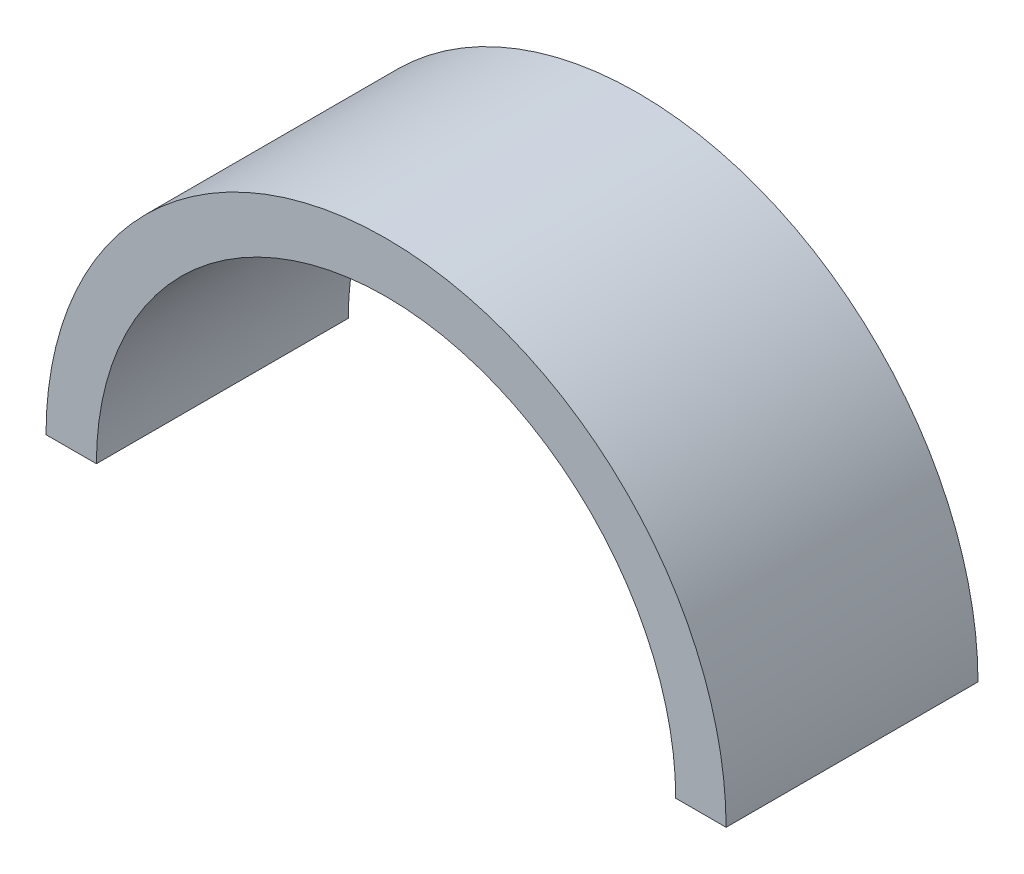
ISO-10303-21;
HEADER;
FILE_DESCRIPTION(('STEP AP214'),'2;1');
FILE_NAME('part.step','',(''),(''),'','','');
FILE_SCHEMA(('AUTOMOTIVE_DESIGN { 1 0 10303 214 1 1 1 1 }'));
ENDSEC;
DATA;
#1=APPLICATION_CONTEXT('core data for automotive mechanical design processes');
#2=APPLICATION_PROTOCOL_DEFINITION('international standard','automotive_design',2000,#1);
#3=PRODUCT_CONTEXT('',#1,'mechanical');
#4=PRODUCT('Part','Part','',(#3));
#5=PRODUCT_RELATED_PRODUCT_CATEGORY('part','',(#4));
#6=PRODUCT_DEFINITION_FORMATION('','',#4);
#7=PRODUCT_DEFINITION_CONTEXT('part definition',#1,'design');
#8=PRODUCT_DEFINITION('design','',#6,#7);
#9=PRODUCT_DEFINITION_SHAPE('','',#8);
#10=(LENGTH_UNIT() NAMED_UNIT(*) SI_UNIT(.MILLI.,.METRE.));
#11=(NAMED_UNIT(*) PLANE_ANGLE_UNIT() SI_UNIT($,.RADIAN.));
#12=(NAMED_UNIT(*) SI_UNIT($,.STERADIAN.) SOLID_ANGLE_UNIT());
#13=UNCERTAINTY_MEASURE_WITH_UNIT(LENGTH_MEASURE(1.E-05),#10,'distance_accuracy_value','');
#14=(GEOMETRIC_REPRESENTATION_CONTEXT(3) GLOBAL_UNCERTAINTY_ASSIGNED_CONTEXT((#13)) GLOBAL_UNIT_ASSIGNED_CONTEXT((#10,
#11,#12)) REPRESENTATION_CONTEXT('',''));
#15=CARTESIAN_POINT('',(0.,0.,0.));
#16=DIRECTION('',(0.,0.,1.));
#17=DIRECTION('',(1.,0.,0.));
#18=AXIS2_PLACEMENT_3D('',#15,#16,#17);
#19=CARTESIAN_POINT('',(27.,27.,20.));
#20=DIRECTION('',(0.,0.,-1.));
#21=DIRECTION('',(-1.,0.,0.));
#22=AXIS2_PLACEMENT_3D('',#19,#20,#21);
#23=CYLINDRICAL_SURFACE('',#22,27.);
#24=CARTESIAN_POINT('',(27.,27.,0.));
#25=DIRECTION('',(0.,0.,1.));
#26=DIRECTION('',(-1.,0.,0.));
#27=AXIS2_PLACEMENT_3D('',#24,#25,#26);
#28=CIRCLE('',#27,27.);
#29=CARTESIAN_POINT('',(54.,27.,0.));
#30=VERTEX_POINT('',#29);
#31=CARTESIAN_POINT('',(0.,27.,0.));
#32=VERTEX_POINT('',#31);
#33=EDGE_CURVE('E108',#30,#32,#28,.T.);
#34=ORIENTED_EDGE('',*,*,#33,.T.);
#35=DIRECTION('',(0.,0.,-1.));
#36=VECTOR('',#35,1.);
#37=CARTESIAN_POINT('',(0.,27.,20.));
#38=LINE('',#37,#36);
#39=CARTESIAN_POINT('',(0.,27.,20.));
#40=VERTEX_POINT('',#39);
#41=EDGE_CURVE('E11',#40,#32,#38,.T.);
#42=ORIENTED_EDGE('',*,*,#41,.F.);
#43=CARTESIAN_POINT('',(27.,27.,20.));
#44=DIRECTION('',(0.,0.,1.));
#45=DIRECTION('',(-1.,0.,0.));
#46=AXIS2_PLACEMENT_3D('',#43,#44,#45);
#47=CIRCLE('',#46,27.);
#48=CARTESIAN_POINT('',(54.,27.,20.));
#49=VERTEX_POINT('',#48);
#50=EDGE_CURVE('E92',#49,#40,#47,.T.);
#51=ORIENTED_EDGE('',*,*,#50,.F.);
#52=DIRECTION('',(0.,0.,-1.));
#53=VECTOR('',#52,1.);
#54=CARTESIAN_POINT('',(54.,27.,20.));
#55=LINE('',#54,#53);
#56=EDGE_CURVE('E105',#49,#30,#55,.T.);
#57=ORIENTED_EDGE('',*,*,#56,.T.);
#58=EDGE_LOOP('',(#34,#42,#51,#57));
#59=FACE_BOUND('',#58,.T.);
#60=ADVANCED_FACE('F43',(#59),#23,.T.);
#61=CARTESIAN_POINT('',(4.,27.,20.));
#62=DIRECTION('',(0.,1.,0.));
#63=DIRECTION('',(0.,0.,1.));
#64=AXIS2_PLACEMENT_3D('',#61,#62,#63);
#65=PLANE('',#64);
#66=DIRECTION('',(1.,0.,0.));
#67=VECTOR('',#66,1.);
#68=CARTESIAN_POINT('',(4.,27.,0.));
#69=LINE('',#68,#67);
#70=CARTESIAN_POINT('',(4.,27.,0.));
#71=VERTEX_POINT('',#70);
#72=EDGE_CURVE('E97',#32,#71,#69,.T.);
#73=ORIENTED_EDGE('',*,*,#72,.T.);
#74=DIRECTION('',(0.,0.,-1.));
#75=VECTOR('',#74,1.);
#76=CARTESIAN_POINT('',(4.,27.,20.));
#77=LINE('',#76,#75);
#78=CARTESIAN_POINT('',(4.,27.,20.));
#79=VERTEX_POINT('',#78);
#80=EDGE_CURVE('E51',#79,#71,#77,.T.);
#81=ORIENTED_EDGE('',*,*,#80,.F.);
#82=DIRECTION('',(1.,0.,0.));
#83=VECTOR('',#82,1.);
#84=CARTESIAN_POINT('',(4.,27.,20.));
#85=LINE('',#84,#83);
#86=EDGE_CURVE('E87',#40,#79,#85,.T.);
#87=ORIENTED_EDGE('',*,*,#86,.F.);
#88=ORIENTED_EDGE('',*,*,#41,.T.);
#89=EDGE_LOOP('',(#73,#81,#87,#88));
#90=FACE_BOUND('',#89,.T.);
#91=ADVANCED_FACE('F100',(#90),#65,.F.);
#92=CARTESIAN_POINT('',(27.,27.,20.));
#93=DIRECTION('',(0.,0.,-1.));
#94=DIRECTION('',(-1.,0.,0.));
#95=AXIS2_PLACEMENT_3D('',#92,#93,#94);
#96=CYLINDRICAL_SURFACE('',#95,23.);
#97=CARTESIAN_POINT('',(27.,27.,0.));
#98=DIRECTION('',(0.,0.,-1.));
#99=DIRECTION('',(1.,0.,0.));
#100=AXIS2_PLACEMENT_3D('',#97,#98,#99);
#101=CIRCLE('',#100,23.);
#102=CARTESIAN_POINT('',(50.,27.,0.));
#103=VERTEX_POINT('',#102);
#104=EDGE_CURVE('E78',#71,#103,#101,.T.);
#105=ORIENTED_EDGE('',*,*,#104,.T.);
#106=DIRECTION('',(0.,0.,-1.));
#107=VECTOR('',#106,1.);
#108=CARTESIAN_POINT('',(50.,27.,20.));
#109=LINE('',#108,#107);
#110=CARTESIAN_POINT('',(50.,27.,20.));
#111=VERTEX_POINT('',#110);
#112=EDGE_CURVE('E98',#111,#103,#109,.T.);
#113=ORIENTED_EDGE('',*,*,#112,.F.);
#114=CARTESIAN_POINT('',(27.,27.,20.));
#115=DIRECTION('',(0.,0.,-1.));
#116=DIRECTION('',(1.,0.,0.));
#117=AXIS2_PLACEMENT_3D('',#114,#115,#116);
#118=CIRCLE('',#117,23.);
#119=EDGE_CURVE('E95',#79,#111,#118,.T.);
#120=ORIENTED_EDGE('',*,*,#119,.F.);
#121=ORIENTED_EDGE('',*,*,#80,.T.);
#122=EDGE_LOOP('',(#105,#113,#120,#121));
#123=FACE_BOUND('',#122,.T.);
#124=ADVANCED_FACE('F99',(#123),#96,.F.);
#125=CARTESIAN_POINT('',(54.,27.,20.));
#126=DIRECTION('',(0.,1.,0.));
#127=DIRECTION('',(0.,0.,1.));
#128=AXIS2_PLACEMENT_3D('',#125,#126,#127);
#129=PLANE('',#128);
#130=DIRECTION('',(1.,0.,0.));
#131=VECTOR('',#130,1.);
#132=CARTESIAN_POINT('',(54.,27.,0.));
#133=LINE('',#132,#131);
#134=EDGE_CURVE('E85',#103,#30,#133,.T.);
#135=ORIENTED_EDGE('',*,*,#134,.T.);
#136=ORIENTED_EDGE('',*,*,#56,.F.);
#137=DIRECTION('',(1.,0.,0.));
#138=VECTOR('',#137,1.);
#139=CARTESIAN_POINT('',(54.,27.,20.));
#140=LINE('',#139,#138);
#141=EDGE_CURVE('E56',#111,#49,#140,.T.);
#142=ORIENTED_EDGE('',*,*,#141,.F.);
#143=ORIENTED_EDGE('',*,*,#112,.T.);
#144=EDGE_LOOP('',(#135,#136,#142,#143));
#145=FACE_BOUND('',#144,.T.);
#146=ADVANCED_FACE('F111',(#145),#129,.F.);
#147=CARTESIAN_POINT('',(27.,27.,20.));
#148=DIRECTION('',(0.,0.,-1.));
#149=DIRECTION('',(-1.,0.,0.));
#150=AXIS2_PLACEMENT_3D('',#147,#148,#149);
#151=PLANE('',#150);
#152=ORIENTED_EDGE('',*,*,#50,.T.);
#153=ORIENTED_EDGE('',*,*,#86,.T.);
#154=ORIENTED_EDGE('',*,*,#119,.T.);
#155=ORIENTED_EDGE('',*,*,#141,.T.);
#156=EDGE_LOOP('',(#152,#153,#154,#155));
#157=FACE_BOUND('',#156,.T.);
#158=ADVANCED_FACE('F89',(#157),#151,.F.);
#159=CARTESIAN_POINT('',(27.,27.,0.));
#160=DIRECTION('',(0.,0.,-1.));
#161=DIRECTION('',(-1.,0.,0.));
#162=AXIS2_PLACEMENT_3D('',#159,#160,#161);
#163=PLANE('',#162);
#164=ORIENTED_EDGE('',*,*,#33,.F.);
#165=ORIENTED_EDGE('',*,*,#134,.F.);
#166=ORIENTED_EDGE('',*,*,#104,.F.);
#167=ORIENTED_EDGE('',*,*,#72,.F.);
#168=EDGE_LOOP('',(#164,#165,#166,#167));
#169=FACE_BOUND('',#168,.T.);
#170=ADVANCED_FACE('F118',(#169),#163,.T.);
#171=CLOSED_SHELL('',(#60,#91,#124,#146,#158,#170));
#172=MANIFOLD_SOLID_BREP('B2',#171);
#173=ADVANCED_BREP_SHAPE_REPRESENTATION('',(#18,#172),#14);
#174=SHAPE_DEFINITION_REPRESENTATION(#9,#173);
ENDSEC;
END-ISO-10303-21;
